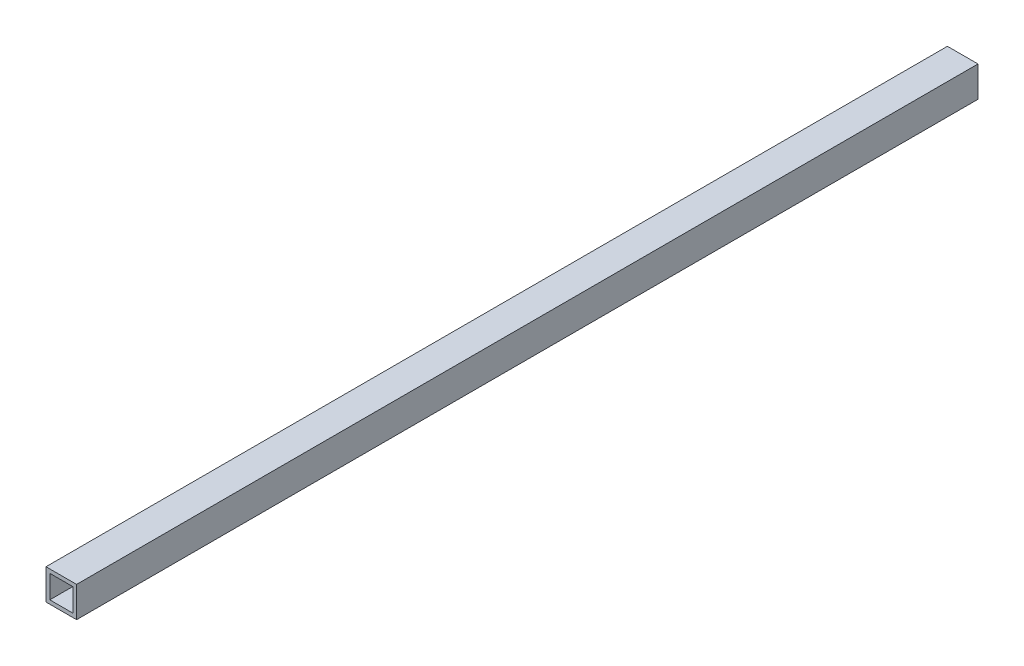
ISO-10303-21;
HEADER;
FILE_DESCRIPTION(('STEP AP214'),'2;1');
FILE_NAME('part.step','',(''),(''),'','','');
FILE_SCHEMA(('AUTOMOTIVE_DESIGN { 1 0 10303 214 1 1 1 1 }'));
ENDSEC;
DATA;
#1=APPLICATION_CONTEXT('core data for automotive mechanical design processes');
#2=APPLICATION_PROTOCOL_DEFINITION('international standard','automotive_design',2000,#1);
#3=PRODUCT_CONTEXT('',#1,'mechanical');
#4=PRODUCT('Part','Part','',(#3));
#5=PRODUCT_RELATED_PRODUCT_CATEGORY('part','',(#4));
#6=PRODUCT_DEFINITION_FORMATION('','',#4);
#7=PRODUCT_DEFINITION_CONTEXT('part definition',#1,'design');
#8=PRODUCT_DEFINITION('design','',#6,#7);
#9=PRODUCT_DEFINITION_SHAPE('','',#8);
#10=(LENGTH_UNIT() NAMED_UNIT(*) SI_UNIT(.MILLI.,.METRE.));
#11=(NAMED_UNIT(*) PLANE_ANGLE_UNIT() SI_UNIT($,.RADIAN.));
#12=(NAMED_UNIT(*) SI_UNIT($,.STERADIAN.) SOLID_ANGLE_UNIT());
#13=UNCERTAINTY_MEASURE_WITH_UNIT(LENGTH_MEASURE(1.E-05),#10,'distance_accuracy_value','');
#14=(GEOMETRIC_REPRESENTATION_CONTEXT(3) GLOBAL_UNCERTAINTY_ASSIGNED_CONTEXT((#13)) GLOBAL_UNIT_ASSIGNED_CONTEXT((#10,
#11,#12)) REPRESENTATION_CONTEXT('',''));
#15=CARTESIAN_POINT('',(0.,0.,0.));
#16=DIRECTION('',(0.,0.,1.));
#17=DIRECTION('',(1.,0.,0.));
#18=AXIS2_PLACEMENT_3D('',#15,#16,#17);
#19=CARTESIAN_POINT('',(-25.3999999999999,25.4,-374.194090512249));
#20=DIRECTION('',(0.,0.,1.));
#21=DIRECTION('',(1.,0.,0.));
#22=AXIS2_PLACEMENT_3D('',#19,#20,#21);
#23=PLANE('',#22);
#24=DIRECTION('',(-1.,0.,0.));
#25=VECTOR('',#24,1.);
#26=CARTESIAN_POINT('',(-3.17499999999989,22.225,-374.194090512249));
#27=LINE('',#26,#25);
#28=CARTESIAN_POINT('',(-3.17499999999989,22.225,-374.194090512249));
#29=VERTEX_POINT('',#28);
#30=CARTESIAN_POINT('',(-22.2249999999999,22.225,-374.194090512249));
#31=VERTEX_POINT('',#30);
#32=EDGE_CURVE('E104',#29,#31,#27,.T.);
#33=ORIENTED_EDGE('',*,*,#32,.T.);
#34=DIRECTION('',(0.,-1.,0.));
#35=VECTOR('',#34,1.);
#36=CARTESIAN_POINT('',(-22.2249999999999,3.175,-374.194090512249));
#37=LINE('',#36,#35);
#38=CARTESIAN_POINT('',(-22.2249999999999,3.175,-374.194090512249));
#39=VERTEX_POINT('',#38);
#40=EDGE_CURVE('E98',#31,#39,#37,.T.);
#41=ORIENTED_EDGE('',*,*,#40,.T.);
#42=DIRECTION('',(1.,0.,0.));
#43=VECTOR('',#42,1.);
#44=CARTESIAN_POINT('',(-3.17499999999989,3.175,-374.194090512249));
#45=LINE('',#44,#43);
#46=CARTESIAN_POINT('',(-3.17499999999989,3.175,-374.194090512249));
#47=VERTEX_POINT('',#46);
#48=EDGE_CURVE('E107',#39,#47,#45,.T.);
#49=ORIENTED_EDGE('',*,*,#48,.T.);
#50=DIRECTION('',(0.,1.,0.));
#51=VECTOR('',#50,1.);
#52=CARTESIAN_POINT('',(-3.17499999999989,3.175,-374.194090512249));
#53=LINE('',#52,#51);
#54=EDGE_CURVE('E46',#47,#29,#53,.T.);
#55=ORIENTED_EDGE('',*,*,#54,.T.);
#56=EDGE_LOOP('',(#33,#41,#49,#55));
#57=FACE_BOUND('',#56,.T.);
#58=DIRECTION('',(-1.,0.,0.));
#59=VECTOR('',#58,1.);
#60=CARTESIAN_POINT('',(-25.3999999999999,0.,-374.194090512249));
#61=LINE('',#60,#59);
#62=CARTESIAN_POINT('',(1.11022302462516E-13,0.,-374.194090512249));
#63=VERTEX_POINT('',#62);
#64=CARTESIAN_POINT('',(-25.3999999999999,0.,-374.194090512249));
#65=VERTEX_POINT('',#64);
#66=EDGE_CURVE('E128',#63,#65,#61,.T.);
#67=ORIENTED_EDGE('',*,*,#66,.T.);
#68=DIRECTION('',(0.,-1.,0.));
#69=VECTOR('',#68,1.);
#70=CARTESIAN_POINT('',(-25.3999999999999,25.4,-374.194090512249));
#71=LINE('',#70,#69);
#72=CARTESIAN_POINT('',(-25.3999999999999,25.4,-374.194090512249));
#73=VERTEX_POINT('',#72);
#74=EDGE_CURVE('E11',#73,#65,#71,.T.);
#75=ORIENTED_EDGE('',*,*,#74,.F.);
#76=DIRECTION('',(-1.,0.,0.));
#77=VECTOR('',#76,1.);
#78=CARTESIAN_POINT('',(-25.3999999999999,25.4,-374.194090512249));
#79=LINE('',#78,#77);
#80=CARTESIAN_POINT('',(1.11022302462516E-13,25.4,-374.194090512249));
#81=VERTEX_POINT('',#80);
#82=EDGE_CURVE('E132',#81,#73,#79,.T.);
#83=ORIENTED_EDGE('',*,*,#82,.F.);
#84=DIRECTION('',(0.,-1.,0.));
#85=VECTOR('',#84,1.);
#86=CARTESIAN_POINT('',(1.11022302462516E-13,25.4,-374.194090512249));
#87=LINE('',#86,#85);
#88=EDGE_CURVE('E142',#81,#63,#87,.T.);
#89=ORIENTED_EDGE('',*,*,#88,.T.);
#90=EDGE_LOOP('',(#67,#75,#83,#89));
#91=FACE_BOUND('',#90,.T.);
#92=ADVANCED_FACE('F32',(#57,#91),#23,.F.);
#93=CARTESIAN_POINT('',(-25.3999999999999,25.4,-374.194090512249));
#94=DIRECTION('',(1.,0.,0.));
#95=DIRECTION('',(0.,0.,-1.));
#96=AXIS2_PLACEMENT_3D('',#93,#94,#95);
#97=PLANE('',#96);
#98=DIRECTION('',(0.,0.,1.));
#99=VECTOR('',#98,1.);
#100=CARTESIAN_POINT('',(-25.3999999999999,0.,-374.194090512249));
#101=LINE('',#100,#99);
#102=CARTESIAN_POINT('',(-25.3999999999999,0.,374.194090512249));
#103=VERTEX_POINT('',#102);
#104=EDGE_CURVE('E145',#65,#103,#101,.T.);
#105=ORIENTED_EDGE('',*,*,#104,.T.);
#106=DIRECTION('',(0.,-1.,0.));
#107=VECTOR('',#106,1.);
#108=CARTESIAN_POINT('',(-25.3999999999999,25.4,374.194090512249));
#109=LINE('',#108,#107);
#110=CARTESIAN_POINT('',(-25.3999999999999,25.4,374.194090512249));
#111=VERTEX_POINT('',#110);
#112=EDGE_CURVE('E39',#111,#103,#109,.T.);
#113=ORIENTED_EDGE('',*,*,#112,.F.);
#114=DIRECTION('',(0.,0.,1.));
#115=VECTOR('',#114,1.);
#116=CARTESIAN_POINT('',(-25.3999999999999,25.4,-374.194090512249));
#117=LINE('',#116,#115);
#118=EDGE_CURVE('E135',#73,#111,#117,.T.);
#119=ORIENTED_EDGE('',*,*,#118,.F.);
#120=ORIENTED_EDGE('',*,*,#74,.T.);
#121=EDGE_LOOP('',(#105,#113,#119,#120));
#122=FACE_BOUND('',#121,.T.);
#123=ADVANCED_FACE('F174',(#122),#97,.F.);
#124=CARTESIAN_POINT('',(-25.3999999999999,25.4,374.194090512249));
#125=DIRECTION('',(0.,0.,-1.));
#126=DIRECTION('',(-1.,0.,0.));
#127=AXIS2_PLACEMENT_3D('',#124,#125,#126);
#128=PLANE('',#127);
#129=DIRECTION('',(1.,0.,0.));
#130=VECTOR('',#129,1.);
#131=CARTESIAN_POINT('',(-3.17499999999989,3.175,374.194090512249));
#132=LINE('',#131,#130);
#133=CARTESIAN_POINT('',(-22.2249999999999,3.175,374.194090512249));
#134=VERTEX_POINT('',#133);
#135=CARTESIAN_POINT('',(-3.17499999999989,3.175,374.194090512249));
#136=VERTEX_POINT('',#135);
#137=EDGE_CURVE('E122',#134,#136,#132,.T.);
#138=ORIENTED_EDGE('',*,*,#137,.F.);
#139=DIRECTION('',(0.,-1.,0.));
#140=VECTOR('',#139,1.);
#141=CARTESIAN_POINT('',(-22.2249999999999,3.175,374.194090512249));
#142=LINE('',#141,#140);
#143=CARTESIAN_POINT('',(-22.2249999999999,22.225,374.194090512249));
#144=VERTEX_POINT('',#143);
#145=EDGE_CURVE('E54',#144,#134,#142,.T.);
#146=ORIENTED_EDGE('',*,*,#145,.F.);
#147=DIRECTION('',(-1.,0.,0.));
#148=VECTOR('',#147,1.);
#149=CARTESIAN_POINT('',(-3.17499999999989,22.225,374.194090512249));
#150=LINE('',#149,#148);
#151=CARTESIAN_POINT('',(-3.17499999999989,22.225,374.194090512249));
#152=VERTEX_POINT('',#151);
#153=EDGE_CURVE('E113',#152,#144,#150,.T.);
#154=ORIENTED_EDGE('',*,*,#153,.F.);
#155=DIRECTION('',(0.,1.,0.));
#156=VECTOR('',#155,1.);
#157=CARTESIAN_POINT('',(-3.17499999999989,3.175,374.194090512249));
#158=LINE('',#157,#156);
#159=EDGE_CURVE('E116',#136,#152,#158,.T.);
#160=ORIENTED_EDGE('',*,*,#159,.F.);
#161=EDGE_LOOP('',(#138,#146,#154,#160));
#162=FACE_BOUND('',#161,.T.);
#163=DIRECTION('',(1.,0.,0.));
#164=VECTOR('',#163,1.);
#165=CARTESIAN_POINT('',(-25.3999999999999,0.,374.194090512249));
#166=LINE('',#165,#164);
#167=CARTESIAN_POINT('',(1.11022302462516E-13,0.,374.194090512249));
#168=VERTEX_POINT('',#167);
#169=EDGE_CURVE('E147',#103,#168,#166,.T.);
#170=ORIENTED_EDGE('',*,*,#169,.T.);
#171=DIRECTION('',(0.,-1.,0.));
#172=VECTOR('',#171,1.);
#173=CARTESIAN_POINT('',(1.11022302462516E-13,25.4,374.194090512249));
#174=LINE('',#173,#172);
#175=CARTESIAN_POINT('',(1.11022302462516E-13,25.4,374.194090512249));
#176=VERTEX_POINT('',#175);
#177=EDGE_CURVE('E152',#176,#168,#174,.T.);
#178=ORIENTED_EDGE('',*,*,#177,.F.);
#179=DIRECTION('',(1.,0.,0.));
#180=VECTOR('',#179,1.);
#181=CARTESIAN_POINT('',(-25.3999999999999,25.4,374.194090512249));
#182=LINE('',#181,#180);
#183=EDGE_CURVE('E138',#111,#176,#182,.T.);
#184=ORIENTED_EDGE('',*,*,#183,.F.);
#185=ORIENTED_EDGE('',*,*,#112,.T.);
#186=EDGE_LOOP('',(#170,#178,#184,#185));
#187=FACE_BOUND('',#186,.T.);
#188=ADVANCED_FACE('F159',(#162,#187),#128,.F.);
#189=CARTESIAN_POINT('',(1.11022302462516E-13,25.4,-374.194090512249));
#190=DIRECTION('',(-1.,0.,0.));
#191=DIRECTION('',(0.,0.,1.));
#192=AXIS2_PLACEMENT_3D('',#189,#190,#191);
#193=PLANE('',#192);
#194=DIRECTION('',(0.,0.,-1.));
#195=VECTOR('',#194,1.);
#196=CARTESIAN_POINT('',(1.11022302462516E-13,0.,-374.194090512249));
#197=LINE('',#196,#195);
#198=EDGE_CURVE('E136',#168,#63,#197,.T.);
#199=ORIENTED_EDGE('',*,*,#198,.T.);
#200=ORIENTED_EDGE('',*,*,#88,.F.);
#201=DIRECTION('',(0.,0.,-1.));
#202=VECTOR('',#201,1.);
#203=CARTESIAN_POINT('',(1.11022302462516E-13,25.4,-374.194090512249));
#204=LINE('',#203,#202);
#205=EDGE_CURVE('E140',#176,#81,#204,.T.);
#206=ORIENTED_EDGE('',*,*,#205,.F.);
#207=ORIENTED_EDGE('',*,*,#177,.T.);
#208=EDGE_LOOP('',(#199,#200,#206,#207));
#209=FACE_BOUND('',#208,.T.);
#210=ADVANCED_FACE('F168',(#209),#193,.F.);
#211=CARTESIAN_POINT('',(0.,25.4,0.));
#212=DIRECTION('',(0.,-1.,0.));
#213=DIRECTION('',(0.,0.,-1.));
#214=AXIS2_PLACEMENT_3D('',#211,#212,#213);
#215=PLANE('',#214);
#216=ORIENTED_EDGE('',*,*,#82,.T.);
#217=ORIENTED_EDGE('',*,*,#118,.T.);
#218=ORIENTED_EDGE('',*,*,#183,.T.);
#219=ORIENTED_EDGE('',*,*,#205,.T.);
#220=EDGE_LOOP('',(#216,#217,#218,#219));
#221=FACE_BOUND('',#220,.T.);
#222=ADVANCED_FACE('F173',(#221),#215,.F.);
#223=CARTESIAN_POINT('',(0.,0.,0.));
#224=DIRECTION('',(0.,-1.,0.));
#225=DIRECTION('',(0.,0.,-1.));
#226=AXIS2_PLACEMENT_3D('',#223,#224,#225);
#227=PLANE('',#226);
#228=ORIENTED_EDGE('',*,*,#66,.F.);
#229=ORIENTED_EDGE('',*,*,#198,.F.);
#230=ORIENTED_EDGE('',*,*,#169,.F.);
#231=ORIENTED_EDGE('',*,*,#104,.F.);
#232=EDGE_LOOP('',(#228,#229,#230,#231));
#233=FACE_BOUND('',#232,.T.);
#234=ADVANCED_FACE('F165',(#233),#227,.T.);
#235=CARTESIAN_POINT('',(-22.2249999999999,3.175,-374.194090512249));
#236=DIRECTION('',(-1.,0.,0.));
#237=DIRECTION('',(0.,0.,1.));
#238=AXIS2_PLACEMENT_3D('',#235,#236,#237);
#239=PLANE('',#238);
#240=ORIENTED_EDGE('',*,*,#145,.T.);
#241=DIRECTION('',(0.,0.,1.));
#242=VECTOR('',#241,1.);
#243=CARTESIAN_POINT('',(-22.2249999999999,3.175,-374.194090512249));
#244=LINE('',#243,#242);
#245=EDGE_CURVE('E94',#39,#134,#244,.T.);
#246=ORIENTED_EDGE('',*,*,#245,.F.);
#247=ORIENTED_EDGE('',*,*,#40,.F.);
#248=DIRECTION('',(0.,0.,1.));
#249=VECTOR('',#248,1.);
#250=CARTESIAN_POINT('',(-22.2249999999999,22.225,-374.194090512249));
#251=LINE('',#250,#249);
#252=EDGE_CURVE('E126',#31,#144,#251,.T.);
#253=ORIENTED_EDGE('',*,*,#252,.T.);
#254=EDGE_LOOP('',(#240,#246,#247,#253));
#255=FACE_BOUND('',#254,.T.);
#256=ADVANCED_FACE('F96',(#255),#239,.F.);
#257=CARTESIAN_POINT('',(-3.17499999999989,22.225,-374.194090512249));
#258=DIRECTION('',(0.,1.,0.));
#259=DIRECTION('',(-1.,0.,0.));
#260=AXIS2_PLACEMENT_3D('',#257,#258,#259);
#261=PLANE('',#260);
#262=ORIENTED_EDGE('',*,*,#153,.T.);
#263=ORIENTED_EDGE('',*,*,#252,.F.);
#264=ORIENTED_EDGE('',*,*,#32,.F.);
#265=DIRECTION('',(0.,0.,1.));
#266=VECTOR('',#265,1.);
#267=CARTESIAN_POINT('',(-3.17499999999989,22.225,-374.194090512249));
#268=LINE('',#267,#266);
#269=EDGE_CURVE('E129',#29,#152,#268,.T.);
#270=ORIENTED_EDGE('',*,*,#269,.T.);
#271=EDGE_LOOP('',(#262,#263,#264,#270));
#272=FACE_BOUND('',#271,.T.);
#273=ADVANCED_FACE('F191',(#272),#261,.F.);
#274=CARTESIAN_POINT('',(-3.17499999999989,3.175,-374.194090512249));
#275=DIRECTION('',(1.,0.,0.));
#276=DIRECTION('',(0.,0.,-1.));
#277=AXIS2_PLACEMENT_3D('',#274,#275,#276);
#278=PLANE('',#277);
#279=ORIENTED_EDGE('',*,*,#159,.T.);
#280=ORIENTED_EDGE('',*,*,#269,.F.);
#281=ORIENTED_EDGE('',*,*,#54,.F.);
#282=DIRECTION('',(0.,0.,1.));
#283=VECTOR('',#282,1.);
#284=CARTESIAN_POINT('',(-3.17499999999989,3.175,-374.194090512249));
#285=LINE('',#284,#283);
#286=EDGE_CURVE('E103',#47,#136,#285,.T.);
#287=ORIENTED_EDGE('',*,*,#286,.T.);
#288=EDGE_LOOP('',(#279,#280,#281,#287));
#289=FACE_BOUND('',#288,.T.);
#290=ADVANCED_FACE('F194',(#289),#278,.F.);
#291=CARTESIAN_POINT('',(-3.17499999999989,3.175,-374.194090512249));
#292=DIRECTION('',(0.,-1.,0.));
#293=DIRECTION('',(1.,0.,0.));
#294=AXIS2_PLACEMENT_3D('',#291,#292,#293);
#295=PLANE('',#294);
#296=ORIENTED_EDGE('',*,*,#137,.T.);
#297=ORIENTED_EDGE('',*,*,#286,.F.);
#298=ORIENTED_EDGE('',*,*,#48,.F.);
#299=ORIENTED_EDGE('',*,*,#245,.T.);
#300=EDGE_LOOP('',(#296,#297,#298,#299));
#301=FACE_BOUND('',#300,.T.);
#302=ADVANCED_FACE('F108',(#301),#295,.F.);
#303=CLOSED_SHELL('',(#92,#123,#188,#210,#222,#234,#256,#273,#290,#302));
#304=MANIFOLD_SOLID_BREP('B2',#303);
#305=ADVANCED_BREP_SHAPE_REPRESENTATION('',(#18,#304),#14);
#306=SHAPE_DEFINITION_REPRESENTATION(#9,#305);
ENDSEC;
END-ISO-10303-21;
